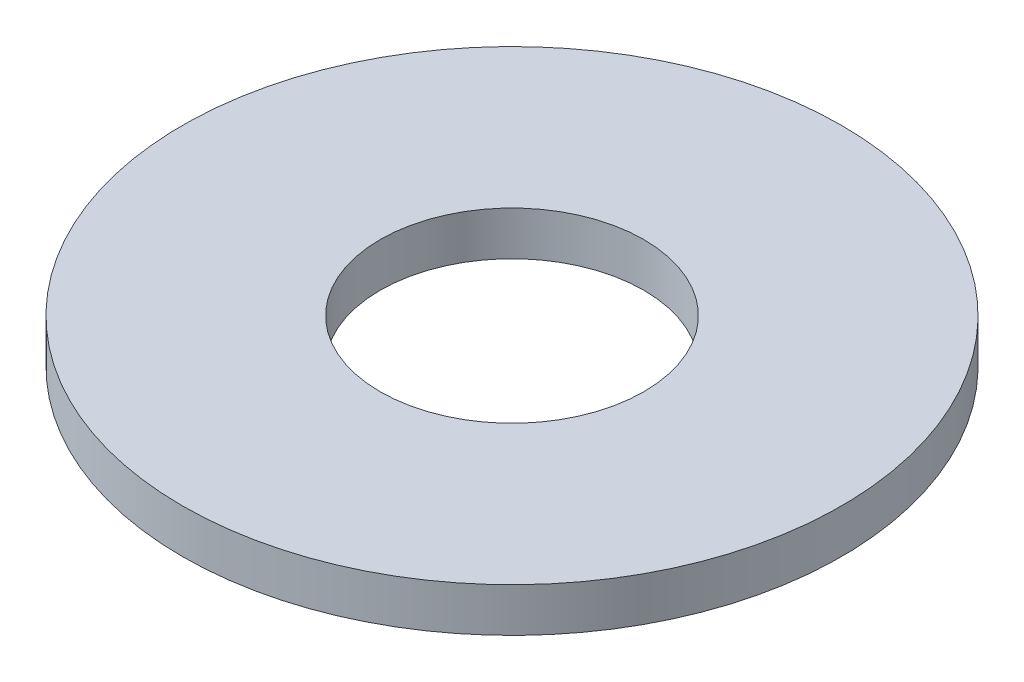
ISO-10303-21;
HEADER;
FILE_DESCRIPTION(('STEP AP214'),'2;1');
FILE_NAME('part.step','',(''),(''),'','','');
FILE_SCHEMA(('AUTOMOTIVE_DESIGN { 1 0 10303 214 1 1 1 1 }'));
ENDSEC;
DATA;
#1=APPLICATION_CONTEXT('core data for automotive mechanical design processes');
#2=APPLICATION_PROTOCOL_DEFINITION('international standard','automotive_design',2000,#1);
#3=PRODUCT_CONTEXT('',#1,'mechanical');
#4=PRODUCT('Part','Part','',(#3));
#5=PRODUCT_RELATED_PRODUCT_CATEGORY('part','',(#4));
#6=PRODUCT_DEFINITION_FORMATION('','',#4);
#7=PRODUCT_DEFINITION_CONTEXT('part definition',#1,'design');
#8=PRODUCT_DEFINITION('design','',#6,#7);
#9=PRODUCT_DEFINITION_SHAPE('','',#8);
#10=(LENGTH_UNIT() NAMED_UNIT(*) SI_UNIT(.MILLI.,.METRE.));
#11=(NAMED_UNIT(*) PLANE_ANGLE_UNIT() SI_UNIT($,.RADIAN.));
#12=(NAMED_UNIT(*) SI_UNIT($,.STERADIAN.) SOLID_ANGLE_UNIT());
#13=UNCERTAINTY_MEASURE_WITH_UNIT(LENGTH_MEASURE(1.E-05),#10,'distance_accuracy_value','');
#14=(GEOMETRIC_REPRESENTATION_CONTEXT(3) GLOBAL_UNCERTAINTY_ASSIGNED_CONTEXT((#13)) GLOBAL_UNIT_ASSIGNED_CONTEXT((#10,
#11,#12)) REPRESENTATION_CONTEXT('',''));
#15=CARTESIAN_POINT('',(0.,0.,0.));
#16=DIRECTION('',(0.,0.,1.));
#17=DIRECTION('',(1.,0.,0.));
#18=AXIS2_PLACEMENT_3D('',#15,#16,#17);
#19=CARTESIAN_POINT('',(0.,1.,0.));
#20=DIRECTION('',(0.,1.,0.));
#21=DIRECTION('',(0.,0.,1.));
#22=AXIS2_PLACEMENT_3D('',#19,#20,#21);
#23=PLANE('',#22);
#24=CARTESIAN_POINT('',(0.,1.,0.));
#25=DIRECTION('',(0.,1.,0.));
#26=DIRECTION('',(0.,0.,1.));
#27=AXIS2_PLACEMENT_3D('',#24,#25,#26);
#28=CIRCLE('',#27,7.5);
#29=CARTESIAN_POINT('',(0.,1.,7.5));
#30=VERTEX_POINT('',#29);
#31=EDGE_CURVE('E10',#30,#30,#28,.T.);
#32=ORIENTED_EDGE('',*,*,#31,.T.);
#33=EDGE_LOOP('',(#32));
#34=FACE_BOUND('',#33,.T.);
#35=CARTESIAN_POINT('',(0.,1.,0.));
#36=DIRECTION('',(0.,1.,0.));
#37=DIRECTION('',(0.,0.,1.));
#38=AXIS2_PLACEMENT_3D('',#35,#36,#37);
#39=CIRCLE('',#38,3.);
#40=CARTESIAN_POINT('',(0.,1.,3.));
#41=VERTEX_POINT('',#40);
#42=EDGE_CURVE('E43',#41,#41,#39,.T.);
#43=ORIENTED_EDGE('',*,*,#42,.F.);
#44=EDGE_LOOP('',(#43));
#45=FACE_BOUND('',#44,.T.);
#46=ADVANCED_FACE('F32',(#34,#45),#23,.T.);
#47=CARTESIAN_POINT('',(0.,0.,0.));
#48=DIRECTION('',(0.,1.,0.));
#49=DIRECTION('',(0.,0.,1.));
#50=AXIS2_PLACEMENT_3D('',#47,#48,#49);
#51=PLANE('',#50);
#52=CARTESIAN_POINT('',(0.,0.,0.));
#53=DIRECTION('',(0.,1.,0.));
#54=DIRECTION('',(0.,0.,1.));
#55=AXIS2_PLACEMENT_3D('',#52,#53,#54);
#56=CIRCLE('',#55,7.5);
#57=CARTESIAN_POINT('',(0.,0.,7.5));
#58=VERTEX_POINT('',#57);
#59=EDGE_CURVE('E36',#58,#58,#56,.T.);
#60=ORIENTED_EDGE('',*,*,#59,.F.);
#61=EDGE_LOOP('',(#60));
#62=FACE_BOUND('',#61,.T.);
#63=CARTESIAN_POINT('',(0.,0.,0.));
#64=DIRECTION('',(0.,1.,0.));
#65=DIRECTION('',(0.,0.,1.));
#66=AXIS2_PLACEMENT_3D('',#63,#64,#65);
#67=CIRCLE('',#66,3.);
#68=CARTESIAN_POINT('',(0.,0.,3.));
#69=VERTEX_POINT('',#68);
#70=EDGE_CURVE('E45',#69,#69,#67,.T.);
#71=ORIENTED_EDGE('',*,*,#70,.T.);
#72=EDGE_LOOP('',(#71));
#73=FACE_BOUND('',#72,.T.);
#74=ADVANCED_FACE('F55',(#62,#73),#51,.F.);
#75=CARTESIAN_POINT('',(0.,1.,0.));
#76=DIRECTION('',(0.,-1.,0.));
#77=DIRECTION('',(0.,0.,-1.));
#78=AXIS2_PLACEMENT_3D('',#75,#76,#77);
#79=CYLINDRICAL_SURFACE('',#78,7.5);
#80=ORIENTED_EDGE('',*,*,#31,.F.);
#81=EDGE_LOOP('',(#80));
#82=FACE_BOUND('',#81,.T.);
#83=ORIENTED_EDGE('',*,*,#59,.T.);
#84=EDGE_LOOP('',(#83));
#85=FACE_BOUND('',#84,.T.);
#86=ADVANCED_FACE('F34',(#82,#85),#79,.T.);
#87=CARTESIAN_POINT('',(0.,1.,0.));
#88=DIRECTION('',(0.,-1.,0.));
#89=DIRECTION('',(0.,0.,-1.));
#90=AXIS2_PLACEMENT_3D('',#87,#88,#89);
#91=CYLINDRICAL_SURFACE('',#90,3.);
#92=ORIENTED_EDGE('',*,*,#42,.T.);
#93=EDGE_LOOP('',(#92));
#94=FACE_BOUND('',#93,.T.);
#95=ORIENTED_EDGE('',*,*,#70,.F.);
#96=EDGE_LOOP('',(#95));
#97=FACE_BOUND('',#96,.T.);
#98=ADVANCED_FACE('F51',(#94,#97),#91,.F.);
#99=CLOSED_SHELL('',(#46,#74,#86,#98));
#100=MANIFOLD_SOLID_BREP('B2',#99);
#101=ADVANCED_BREP_SHAPE_REPRESENTATION('',(#18,#100),#14);
#102=SHAPE_DEFINITION_REPRESENTATION(#9,#101);
ENDSEC;
END-ISO-10303-21;
